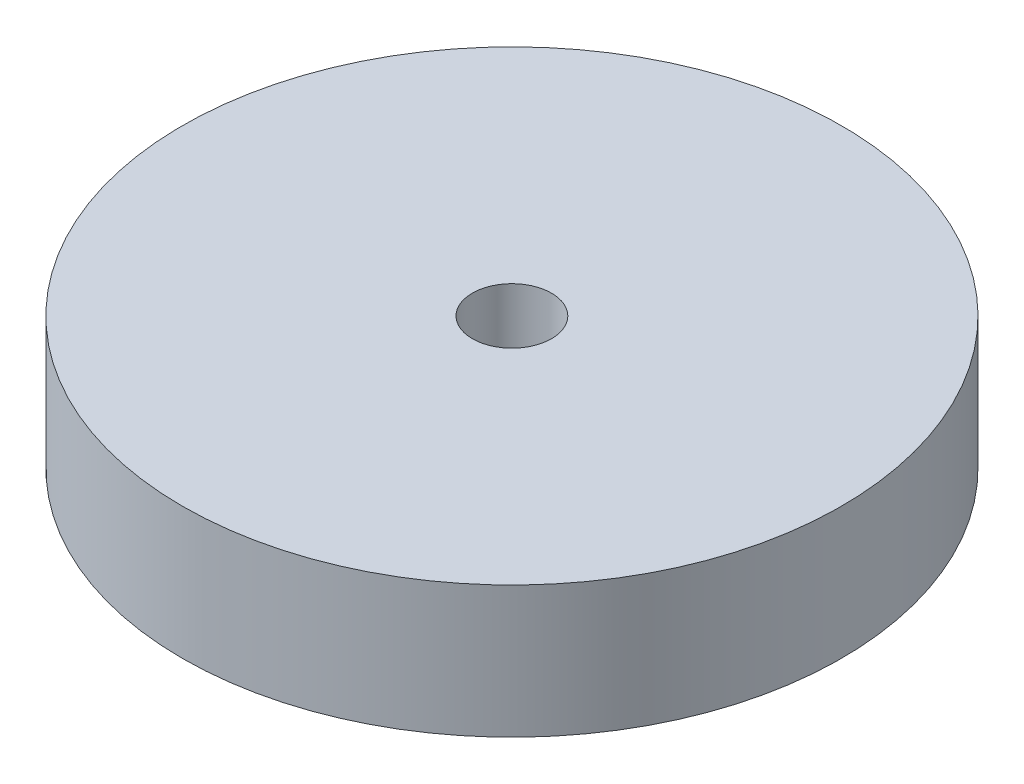
ISO-10303-21;
HEADER;
FILE_DESCRIPTION(('STEP AP214'),'2;1');
FILE_NAME('part.step','',(''),(''),'','','');
FILE_SCHEMA(('AUTOMOTIVE_DESIGN { 1 0 10303 214 1 1 1 1 }'));
ENDSEC;
DATA;
#1=APPLICATION_CONTEXT('core data for automotive mechanical design processes');
#2=APPLICATION_PROTOCOL_DEFINITION('international standard','automotive_design',2000,#1);
#3=PRODUCT_CONTEXT('',#1,'mechanical');
#4=PRODUCT('Part','Part','',(#3));
#5=PRODUCT_RELATED_PRODUCT_CATEGORY('part','',(#4));
#6=PRODUCT_DEFINITION_FORMATION('','',#4);
#7=PRODUCT_DEFINITION_CONTEXT('part definition',#1,'design');
#8=PRODUCT_DEFINITION('design','',#6,#7);
#9=PRODUCT_DEFINITION_SHAPE('','',#8);
#10=(LENGTH_UNIT() NAMED_UNIT(*) SI_UNIT(.MILLI.,.METRE.));
#11=(NAMED_UNIT(*) PLANE_ANGLE_UNIT() SI_UNIT($,.RADIAN.));
#12=(NAMED_UNIT(*) SI_UNIT($,.STERADIAN.) SOLID_ANGLE_UNIT());
#13=UNCERTAINTY_MEASURE_WITH_UNIT(LENGTH_MEASURE(1.E-05),#10,'distance_accuracy_value','');
#14=(GEOMETRIC_REPRESENTATION_CONTEXT(3) GLOBAL_UNCERTAINTY_ASSIGNED_CONTEXT((#13)) GLOBAL_UNIT_ASSIGNED_CONTEXT((#10,
#11,#12)) REPRESENTATION_CONTEXT('',''));
#15=CARTESIAN_POINT('',(0.,0.,0.));
#16=DIRECTION('',(0.,0.,1.));
#17=DIRECTION('',(1.,0.,0.));
#18=AXIS2_PLACEMENT_3D('',#15,#16,#17);
#19=CARTESIAN_POINT('',(0.,50.,250.));
#20=DIRECTION('',(0.,1.,0.));
#21=DIRECTION('',(0.,0.,1.));
#22=AXIS2_PLACEMENT_3D('',#19,#20,#21);
#23=PLANE('',#22);
#24=CARTESIAN_POINT('',(0.,50.,0.));
#25=DIRECTION('',(0.,1.,0.));
#26=DIRECTION('',(0.,0.,1.));
#27=AXIS2_PLACEMENT_3D('',#24,#25,#26);
#28=CIRCLE('',#27,250.);
#29=CARTESIAN_POINT('',(0.,50.,250.));
#30=VERTEX_POINT('',#29);
#31=EDGE_CURVE('E45',#30,#30,#28,.T.);
#32=ORIENTED_EDGE('',*,*,#31,.T.);
#33=EDGE_LOOP('',(#32));
#34=FACE_BOUND('',#33,.T.);
#35=CARTESIAN_POINT('',(0.,50.,0.));
#36=DIRECTION('',(0.,1.,0.));
#37=DIRECTION('',(0.,0.,1.));
#38=AXIS2_PLACEMENT_3D('',#35,#36,#37);
#39=CIRCLE('',#38,29.9999999999999);
#40=CARTESIAN_POINT('',(0.,50.,29.9999999999999));
#41=VERTEX_POINT('',#40);
#42=EDGE_CURVE('E10',#41,#41,#39,.T.);
#43=ORIENTED_EDGE('',*,*,#42,.F.);
#44=EDGE_LOOP('',(#43));
#45=FACE_BOUND('',#44,.T.);
#46=ADVANCED_FACE('F31',(#34,#45),#23,.T.);
#47=CARTESIAN_POINT('',(0.,265.422077922078,0.));
#48=DIRECTION('',(0.,1.,0.));
#49=DIRECTION('',(0.,0.,1.));
#50=AXIS2_PLACEMENT_3D('',#47,#48,#49);
#51=CYLINDRICAL_SURFACE('',#50,29.9999999999999);
#52=ORIENTED_EDGE('',*,*,#42,.T.);
#53=EDGE_LOOP('',(#52));
#54=FACE_BOUND('',#53,.T.);
#55=CARTESIAN_POINT('',(0.,-50.,0.));
#56=DIRECTION('',(0.,1.,0.));
#57=DIRECTION('',(0.,0.,1.));
#58=AXIS2_PLACEMENT_3D('',#55,#56,#57);
#59=CIRCLE('',#58,29.9999999999999);
#60=CARTESIAN_POINT('',(0.,-50.,29.9999999999999));
#61=VERTEX_POINT('',#60);
#62=EDGE_CURVE('E37',#61,#61,#59,.T.);
#63=ORIENTED_EDGE('',*,*,#62,.F.);
#64=EDGE_LOOP('',(#63));
#65=FACE_BOUND('',#64,.T.);
#66=ADVANCED_FACE('F61',(#54,#65),#51,.F.);
#67=CARTESIAN_POINT('',(0.,-50.,29.9999999999999));
#68=DIRECTION('',(0.,-1.,0.));
#69=DIRECTION('',(0.,0.,-1.));
#70=AXIS2_PLACEMENT_3D('',#67,#68,#69);
#71=PLANE('',#70);
#72=ORIENTED_EDGE('',*,*,#62,.T.);
#73=EDGE_LOOP('',(#72));
#74=FACE_BOUND('',#73,.T.);
#75=CARTESIAN_POINT('',(0.,-50.,0.));
#76=DIRECTION('',(0.,1.,0.));
#77=DIRECTION('',(0.,0.,1.));
#78=AXIS2_PLACEMENT_3D('',#75,#76,#77);
#79=CIRCLE('',#78,250.);
#80=CARTESIAN_POINT('',(0.,-50.,250.));
#81=VERTEX_POINT('',#80);
#82=EDGE_CURVE('E41',#81,#81,#79,.T.);
#83=ORIENTED_EDGE('',*,*,#82,.F.);
#84=EDGE_LOOP('',(#83));
#85=FACE_BOUND('',#84,.T.);
#86=ADVANCED_FACE('F55',(#74,#85),#71,.T.);
#87=CARTESIAN_POINT('',(0.,265.422077922078,0.));
#88=DIRECTION('',(0.,1.,0.));
#89=DIRECTION('',(0.,0.,1.));
#90=AXIS2_PLACEMENT_3D('',#87,#88,#89);
#91=CYLINDRICAL_SURFACE('',#90,250.);
#92=ORIENTED_EDGE('',*,*,#82,.T.);
#93=EDGE_LOOP('',(#92));
#94=FACE_BOUND('',#93,.T.);
#95=ORIENTED_EDGE('',*,*,#31,.F.);
#96=EDGE_LOOP('',(#95));
#97=FACE_BOUND('',#96,.T.);
#98=ADVANCED_FACE('F53',(#94,#97),#91,.T.);
#99=CLOSED_SHELL('',(#46,#66,#86,#98));
#100=MANIFOLD_SOLID_BREP('B2',#99);
#101=ADVANCED_BREP_SHAPE_REPRESENTATION('',(#18,#100),#14);
#102=SHAPE_DEFINITION_REPRESENTATION(#9,#101);
ENDSEC;
END-ISO-10303-21;
